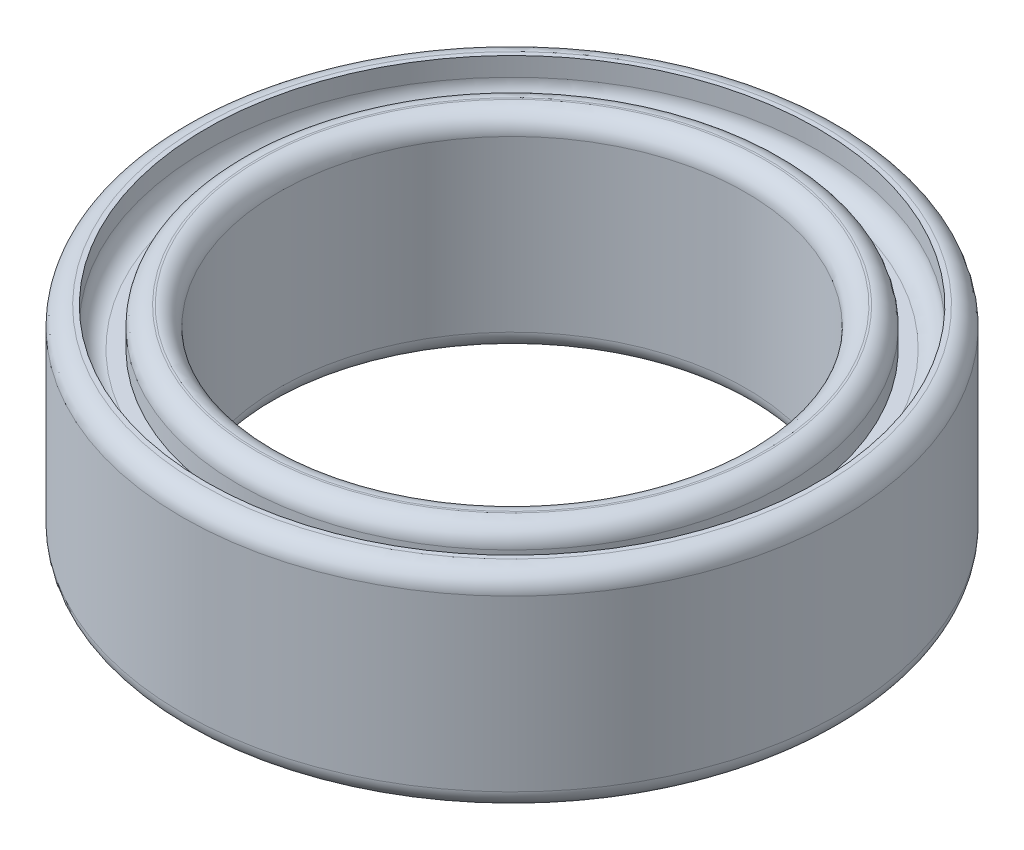
ISO-10303-21;
HEADER;
FILE_DESCRIPTION(('STEP AP214'),'2;1');
FILE_NAME('part.step','',(''),(''),'','','');
FILE_SCHEMA(('AUTOMOTIVE_DESIGN { 1 0 10303 214 1 1 1 1 }'));
ENDSEC;
DATA;
#1=APPLICATION_CONTEXT('core data for automotive mechanical design processes');
#2=APPLICATION_PROTOCOL_DEFINITION('international standard','automotive_design',2000,#1);
#3=PRODUCT_CONTEXT('',#1,'mechanical');
#4=PRODUCT('Part','Part','',(#3));
#5=PRODUCT_RELATED_PRODUCT_CATEGORY('part','',(#4));
#6=PRODUCT_DEFINITION_FORMATION('','',#4);
#7=PRODUCT_DEFINITION_CONTEXT('part definition',#1,'design');
#8=PRODUCT_DEFINITION('design','',#6,#7);
#9=PRODUCT_DEFINITION_SHAPE('','',#8);
#10=(LENGTH_UNIT() NAMED_UNIT(*) SI_UNIT(.MILLI.,.METRE.));
#11=(NAMED_UNIT(*) PLANE_ANGLE_UNIT() SI_UNIT($,.RADIAN.));
#12=(NAMED_UNIT(*) SI_UNIT($,.STERADIAN.) SOLID_ANGLE_UNIT());
#13=UNCERTAINTY_MEASURE_WITH_UNIT(LENGTH_MEASURE(1.E-05),#10,'distance_accuracy_value','');
#14=(GEOMETRIC_REPRESENTATION_CONTEXT(3) GLOBAL_UNCERTAINTY_ASSIGNED_CONTEXT((#13)) GLOBAL_UNIT_ASSIGNED_CONTEXT((#10,
#11,#12)) REPRESENTATION_CONTEXT('',''));
#15=CARTESIAN_POINT('',(0.,0.,0.));
#16=DIRECTION('',(0.,0.,1.));
#17=DIRECTION('',(1.,0.,0.));
#18=AXIS2_PLACEMENT_3D('',#15,#16,#17);
#19=CARTESIAN_POINT('',(0.,0.,0.));
#20=DIRECTION('',(0.,1.,0.));
#21=DIRECTION('',(0.,0.,1.));
#22=AXIS2_PLACEMENT_3D('',#19,#20,#21);
#23=PLANE('',#22);
#24=CARTESIAN_POINT('',(0.,0.,0.));
#25=DIRECTION('',(0.,1.,0.));
#26=DIRECTION('',(0.,0.,1.));
#27=AXIS2_PLACEMENT_3D('',#24,#25,#26);
#28=CIRCLE('',#27,13.5);
#29=CARTESIAN_POINT('',(0.,0.,13.5));
#30=VERTEX_POINT('',#29);
#31=EDGE_CURVE('E77',#30,#30,#28,.F.);
#32=ORIENTED_EDGE('',*,*,#31,.T.);
#33=EDGE_LOOP('',(#32));
#34=FACE_BOUND('',#33,.T.);
#35=CARTESIAN_POINT('',(0.,0.,0.));
#36=DIRECTION('',(0.,1.,0.));
#37=DIRECTION('',(0.,0.,1.));
#38=AXIS2_PLACEMENT_3D('',#35,#36,#37);
#39=CIRCLE('',#38,13.4);
#40=CARTESIAN_POINT('',(0.,0.,13.4));
#41=VERTEX_POINT('',#40);
#42=EDGE_CURVE('E80',#41,#41,#39,.T.);
#43=ORIENTED_EDGE('',*,*,#42,.T.);
#44=EDGE_LOOP('',(#43));
#45=FACE_BOUND('',#44,.T.);
#46=ADVANCED_FACE('F36',(#34,#45),#23,.F.);
#47=CARTESIAN_POINT('',(0.,11.,0.));
#48=DIRECTION('',(0.,1.,0.));
#49=DIRECTION('',(0.,0.,1.));
#50=AXIS2_PLACEMENT_3D('',#47,#48,#49);
#51=PLANE('',#50);
#52=CARTESIAN_POINT('',(0.,11.,0.));
#53=DIRECTION('',(0.,1.,0.));
#54=DIRECTION('',(0.,0.,1.));
#55=AXIS2_PLACEMENT_3D('',#52,#53,#54);
#56=CIRCLE('',#55,13.5);
#57=CARTESIAN_POINT('',(0.,11.,13.5));
#58=VERTEX_POINT('',#57);
#59=EDGE_CURVE('E71',#58,#58,#56,.T.);
#60=ORIENTED_EDGE('',*,*,#59,.T.);
#61=EDGE_LOOP('',(#60));
#62=FACE_BOUND('',#61,.T.);
#63=CARTESIAN_POINT('',(0.,11.,0.));
#64=DIRECTION('',(0.,1.,0.));
#65=DIRECTION('',(0.,0.,1.));
#66=AXIS2_PLACEMENT_3D('',#63,#64,#65);
#67=CIRCLE('',#66,13.4);
#68=CARTESIAN_POINT('',(0.,11.,13.4));
#69=VERTEX_POINT('',#68);
#70=EDGE_CURVE('E83',#69,#69,#67,.F.);
#71=ORIENTED_EDGE('',*,*,#70,.T.);
#72=EDGE_LOOP('',(#71));
#73=FACE_BOUND('',#72,.T.);
#74=ADVANCED_FACE('F121',(#62,#73),#51,.T.);
#75=CARTESIAN_POINT('',(0.,11.,0.));
#76=DIRECTION('',(0.,1.,0.));
#77=DIRECTION('',(0.,0.,1.));
#78=AXIS2_PLACEMENT_3D('',#75,#76,#77);
#79=CIRCLE('',#78,16.5);
#80=CARTESIAN_POINT('',(0.,11.,16.5));
#81=VERTEX_POINT('',#80);
#82=EDGE_CURVE('E65',#81,#81,#79,.T.);
#83=ORIENTED_EDGE('',*,*,#82,.T.);
#84=EDGE_LOOP('',(#83));
#85=FACE_BOUND('',#84,.T.);
#86=CARTESIAN_POINT('',(0.,11.,0.));
#87=DIRECTION('',(0.,1.,0.));
#88=DIRECTION('',(0.,0.,1.));
#89=AXIS2_PLACEMENT_3D('',#86,#87,#88);
#90=CIRCLE('',#89,16.25);
#91=CARTESIAN_POINT('',(0.,11.,16.25));
#92=VERTEX_POINT('',#91);
#93=EDGE_CURVE('E92',#92,#92,#90,.T.);
#94=ORIENTED_EDGE('',*,*,#93,.F.);
#95=EDGE_LOOP('',(#94));
#96=FACE_BOUND('',#95,.T.);
#97=ADVANCED_FACE('F128',(#85,#96),#51,.T.);
#98=CARTESIAN_POINT('',(0.,0.,0.));
#99=DIRECTION('',(0.,1.,0.));
#100=DIRECTION('',(0.,0.,1.));
#101=AXIS2_PLACEMENT_3D('',#98,#99,#100);
#102=CIRCLE('',#101,16.5);
#103=CARTESIAN_POINT('',(0.,0.,16.5));
#104=VERTEX_POINT('',#103);
#105=EDGE_CURVE('E56',#104,#104,#102,.F.);
#106=ORIENTED_EDGE('',*,*,#105,.T.);
#107=EDGE_LOOP('',(#106));
#108=FACE_BOUND('',#107,.T.);
#109=CARTESIAN_POINT('',(0.,0.,0.));
#110=DIRECTION('',(0.,-1.,0.));
#111=DIRECTION('',(0.,0.,-1.));
#112=AXIS2_PLACEMENT_3D('',#109,#110,#111);
#113=CIRCLE('',#112,16.25);
#114=CARTESIAN_POINT('',(0.,0.,-16.25));
#115=VERTEX_POINT('',#114);
#116=EDGE_CURVE('E98',#115,#115,#113,.T.);
#117=ORIENTED_EDGE('',*,*,#116,.F.);
#118=EDGE_LOOP('',(#117));
#119=FACE_BOUND('',#118,.T.);
#120=ADVANCED_FACE('F124',(#108,#119),#23,.F.);
#121=CARTESIAN_POINT('',(0.,11.,0.));
#122=DIRECTION('',(0.,-1.,0.));
#123=DIRECTION('',(0.,0.,-1.));
#124=AXIS2_PLACEMENT_3D('',#121,#122,#123);
#125=CYLINDRICAL_SURFACE('',#124,17.5);
#126=CARTESIAN_POINT('',(0.,10.,0.));
#127=DIRECTION('',(0.,1.,0.));
#128=DIRECTION('',(0.,0.,1.));
#129=AXIS2_PLACEMENT_3D('',#126,#127,#128);
#130=CIRCLE('',#129,17.5);
#131=CARTESIAN_POINT('',(0.,10.,17.5));
#132=VERTEX_POINT('',#131);
#133=EDGE_CURVE('E59',#132,#132,#130,.F.);
#134=ORIENTED_EDGE('',*,*,#133,.T.);
#135=EDGE_LOOP('',(#134));
#136=FACE_BOUND('',#135,.T.);
#137=CARTESIAN_POINT('',(0.,1.,0.));
#138=DIRECTION('',(0.,1.,0.));
#139=DIRECTION('',(0.,0.,1.));
#140=AXIS2_PLACEMENT_3D('',#137,#138,#139);
#141=CIRCLE('',#140,17.5);
#142=CARTESIAN_POINT('',(0.,1.,17.5));
#143=VERTEX_POINT('',#142);
#144=EDGE_CURVE('E62',#143,#143,#141,.T.);
#145=ORIENTED_EDGE('',*,*,#144,.T.);
#146=EDGE_LOOP('',(#145));
#147=FACE_BOUND('',#146,.T.);
#148=ADVANCED_FACE('F134',(#136,#147),#125,.T.);
#149=CARTESIAN_POINT('',(0.,11.,0.));
#150=DIRECTION('',(0.,-1.,0.));
#151=DIRECTION('',(0.,0.,-1.));
#152=AXIS2_PLACEMENT_3D('',#149,#150,#151);
#153=CYLINDRICAL_SURFACE('',#152,12.4);
#154=CARTESIAN_POINT('',(0.,10.,0.));
#155=DIRECTION('',(0.,1.,0.));
#156=DIRECTION('',(0.,0.,1.));
#157=AXIS2_PLACEMENT_3D('',#154,#155,#156);
#158=CIRCLE('',#157,12.4);
#159=CARTESIAN_POINT('',(0.,10.,12.4));
#160=VERTEX_POINT('',#159);
#161=EDGE_CURVE('E86',#160,#160,#158,.T.);
#162=ORIENTED_EDGE('',*,*,#161,.T.);
#163=EDGE_LOOP('',(#162));
#164=FACE_BOUND('',#163,.T.);
#165=CARTESIAN_POINT('',(0.,1.,0.));
#166=DIRECTION('',(0.,1.,0.));
#167=DIRECTION('',(0.,0.,1.));
#168=AXIS2_PLACEMENT_3D('',#165,#166,#167);
#169=CIRCLE('',#168,12.4);
#170=CARTESIAN_POINT('',(0.,1.,12.4));
#171=VERTEX_POINT('',#170);
#172=EDGE_CURVE('E89',#171,#171,#169,.F.);
#173=ORIENTED_EDGE('',*,*,#172,.T.);
#174=EDGE_LOOP('',(#173));
#175=FACE_BOUND('',#174,.T.);
#176=ADVANCED_FACE('F140',(#164,#175),#153,.F.);
#177=CARTESIAN_POINT('',(0.,10.,0.));
#178=DIRECTION('',(0.,1.,0.));
#179=DIRECTION('',(0.,0.,1.));
#180=AXIS2_PLACEMENT_3D('',#177,#178,#179);
#181=TOROIDAL_SURFACE('',#180,13.4,1.);
#182=ORIENTED_EDGE('',*,*,#70,.F.);
#183=EDGE_LOOP('',(#182));
#184=FACE_BOUND('',#183,.T.);
#185=ORIENTED_EDGE('',*,*,#161,.F.);
#186=EDGE_LOOP('',(#185));
#187=FACE_BOUND('',#186,.T.);
#188=ADVANCED_FACE('F175',(#184,#187),#181,.T.);
#189=CARTESIAN_POINT('',(0.,1.,0.));
#190=DIRECTION('',(0.,1.,0.));
#191=DIRECTION('',(0.,0.,1.));
#192=AXIS2_PLACEMENT_3D('',#189,#190,#191);
#193=TOROIDAL_SURFACE('',#192,13.4,1.);
#194=ORIENTED_EDGE('',*,*,#172,.F.);
#195=EDGE_LOOP('',(#194));
#196=FACE_BOUND('',#195,.T.);
#197=ORIENTED_EDGE('',*,*,#42,.F.);
#198=EDGE_LOOP('',(#197));
#199=FACE_BOUND('',#198,.T.);
#200=ADVANCED_FACE('F171',(#196,#199),#193,.T.);
#201=CARTESIAN_POINT('',(0.,9.,0.));
#202=DIRECTION('',(0.,1.,0.));
#203=DIRECTION('',(0.,0.,1.));
#204=AXIS2_PLACEMENT_3D('',#201,#202,#203);
#205=CYLINDRICAL_SURFACE('',#204,16.25);
#206=CARTESIAN_POINT('',(0.,10.,0.));
#207=DIRECTION('',(0.,1.,0.));
#208=DIRECTION('',(0.,0.,1.));
#209=AXIS2_PLACEMENT_3D('',#206,#207,#208);
#210=CIRCLE('',#209,16.25);
#211=CARTESIAN_POINT('',(0.,10.,16.25));
#212=VERTEX_POINT('',#211);
#213=EDGE_CURVE('E47',#212,#212,#210,.F.);
#214=ORIENTED_EDGE('',*,*,#213,.T.);
#215=EDGE_LOOP('',(#214));
#216=FACE_BOUND('',#215,.T.);
#217=ORIENTED_EDGE('',*,*,#93,.T.);
#218=EDGE_LOOP('',(#217));
#219=FACE_BOUND('',#218,.T.);
#220=ADVANCED_FACE('F174',(#216,#219),#205,.F.);
#221=CARTESIAN_POINT('',(0.,9.,0.));
#222=DIRECTION('',(0.,1.,0.));
#223=DIRECTION('',(0.,0.,1.));
#224=AXIS2_PLACEMENT_3D('',#221,#222,#223);
#225=PLANE('',#224);
#226=CARTESIAN_POINT('',(0.,9.,0.));
#227=DIRECTION('',(0.,1.,0.));
#228=DIRECTION('',(0.,0.,1.));
#229=AXIS2_PLACEMENT_3D('',#226,#227,#228);
#230=CIRCLE('',#229,15.25);
#231=CARTESIAN_POINT('',(0.,9.,15.25));
#232=VERTEX_POINT('',#231);
#233=EDGE_CURVE('E51',#232,#232,#230,.T.);
#234=ORIENTED_EDGE('',*,*,#233,.T.);
#235=EDGE_LOOP('',(#234));
#236=FACE_BOUND('',#235,.T.);
#237=CARTESIAN_POINT('',(0.,9.,0.));
#238=DIRECTION('',(0.,1.,0.));
#239=DIRECTION('',(0.,0.,1.));
#240=AXIS2_PLACEMENT_3D('',#237,#238,#239);
#241=CIRCLE('',#240,14.5);
#242=CARTESIAN_POINT('',(0.,9.,14.5));
#243=VERTEX_POINT('',#242);
#244=EDGE_CURVE('E95',#243,#243,#241,.T.);
#245=ORIENTED_EDGE('',*,*,#244,.F.);
#246=EDGE_LOOP('',(#245));
#247=FACE_BOUND('',#246,.T.);
#248=ADVANCED_FACE('F197',(#236,#247),#225,.T.);
#249=CARTESIAN_POINT('',(0.,9.,0.));
#250=DIRECTION('',(0.,1.,0.));
#251=DIRECTION('',(0.,0.,1.));
#252=AXIS2_PLACEMENT_3D('',#249,#250,#251);
#253=CYLINDRICAL_SURFACE('',#252,14.5);
#254=CARTESIAN_POINT('',(0.,10.,0.));
#255=DIRECTION('',(0.,1.,0.));
#256=DIRECTION('',(0.,0.,1.));
#257=AXIS2_PLACEMENT_3D('',#254,#255,#256);
#258=CIRCLE('',#257,14.5);
#259=CARTESIAN_POINT('',(0.,10.,14.5));
#260=VERTEX_POINT('',#259);
#261=EDGE_CURVE('E68',#260,#260,#258,.F.);
#262=ORIENTED_EDGE('',*,*,#261,.T.);
#263=EDGE_LOOP('',(#262));
#264=FACE_BOUND('',#263,.T.);
#265=ORIENTED_EDGE('',*,*,#244,.T.);
#266=EDGE_LOOP('',(#265));
#267=FACE_BOUND('',#266,.T.);
#268=ADVANCED_FACE('F118',(#264,#267),#253,.T.);
#269=CARTESIAN_POINT('',(0.,2.,0.));
#270=DIRECTION('',(0.,-1.,0.));
#271=DIRECTION('',(0.,0.,-1.));
#272=AXIS2_PLACEMENT_3D('',#269,#270,#271);
#273=CYLINDRICAL_SURFACE('',#272,16.25);
#274=CARTESIAN_POINT('',(0.,1.,0.));
#275=DIRECTION('',(0.,-1.,0.));
#276=DIRECTION('',(0.,0.,-1.));
#277=AXIS2_PLACEMENT_3D('',#274,#275,#276);
#278=CIRCLE('',#277,16.25);
#279=CARTESIAN_POINT('',(0.,1.,-16.25));
#280=VERTEX_POINT('',#279);
#281=EDGE_CURVE('E10',#280,#280,#278,.F.);
#282=ORIENTED_EDGE('',*,*,#281,.T.);
#283=EDGE_LOOP('',(#282));
#284=FACE_BOUND('',#283,.T.);
#285=ORIENTED_EDGE('',*,*,#116,.T.);
#286=EDGE_LOOP('',(#285));
#287=FACE_BOUND('',#286,.T.);
#288=ADVANCED_FACE('F109',(#284,#287),#273,.F.);
#289=CARTESIAN_POINT('',(0.,2.,0.));
#290=DIRECTION('',(0.,-1.,0.));
#291=DIRECTION('',(0.,0.,-1.));
#292=AXIS2_PLACEMENT_3D('',#289,#290,#291);
#293=PLANE('',#292);
#294=CARTESIAN_POINT('',(0.,2.,0.));
#295=DIRECTION('',(0.,-1.,0.));
#296=DIRECTION('',(0.,0.,-1.));
#297=AXIS2_PLACEMENT_3D('',#294,#295,#296);
#298=CIRCLE('',#297,15.25);
#299=CARTESIAN_POINT('',(0.,2.,-15.25));
#300=VERTEX_POINT('',#299);
#301=EDGE_CURVE('E43',#300,#300,#298,.T.);
#302=ORIENTED_EDGE('',*,*,#301,.T.);
#303=EDGE_LOOP('',(#302));
#304=FACE_BOUND('',#303,.T.);
#305=CARTESIAN_POINT('',(0.,2.,0.));
#306=DIRECTION('',(0.,-1.,0.));
#307=DIRECTION('',(0.,0.,-1.));
#308=AXIS2_PLACEMENT_3D('',#305,#306,#307);
#309=CIRCLE('',#308,14.5);
#310=CARTESIAN_POINT('',(0.,2.,-14.5));
#311=VERTEX_POINT('',#310);
#312=EDGE_CURVE('E101',#311,#311,#309,.T.);
#313=ORIENTED_EDGE('',*,*,#312,.F.);
#314=EDGE_LOOP('',(#313));
#315=FACE_BOUND('',#314,.T.);
#316=ADVANCED_FACE('F107',(#304,#315),#293,.T.);
#317=CARTESIAN_POINT('',(0.,2.,0.));
#318=DIRECTION('',(0.,-1.,0.));
#319=DIRECTION('',(0.,0.,-1.));
#320=AXIS2_PLACEMENT_3D('',#317,#318,#319);
#321=CYLINDRICAL_SURFACE('',#320,14.5);
#322=CARTESIAN_POINT('',(0.,1.,0.));
#323=DIRECTION('',(0.,1.,0.));
#324=DIRECTION('',(0.,0.,1.));
#325=AXIS2_PLACEMENT_3D('',#322,#323,#324);
#326=CIRCLE('',#325,14.5);
#327=CARTESIAN_POINT('',(0.,1.,14.5));
#328=VERTEX_POINT('',#327);
#329=EDGE_CURVE('E74',#328,#328,#326,.T.);
#330=ORIENTED_EDGE('',*,*,#329,.T.);
#331=EDGE_LOOP('',(#330));
#332=FACE_BOUND('',#331,.T.);
#333=ORIENTED_EDGE('',*,*,#312,.T.);
#334=EDGE_LOOP('',(#333));
#335=FACE_BOUND('',#334,.T.);
#336=ADVANCED_FACE('F105',(#332,#335),#321,.T.);
#337=CARTESIAN_POINT('',(0.,1.,0.));
#338=DIRECTION('',(0.,1.,0.));
#339=DIRECTION('',(0.,0.,1.));
#340=AXIS2_PLACEMENT_3D('',#337,#338,#339);
#341=TOROIDAL_SURFACE('',#340,13.5,1.);
#342=ORIENTED_EDGE('',*,*,#329,.F.);
#343=EDGE_LOOP('',(#342));
#344=FACE_BOUND('',#343,.T.);
#345=ORIENTED_EDGE('',*,*,#31,.F.);
#346=EDGE_LOOP('',(#345));
#347=FACE_BOUND('',#346,.T.);
#348=ADVANCED_FACE('F115',(#344,#347),#341,.T.);
#349=CARTESIAN_POINT('',(0.,10.,0.));
#350=DIRECTION('',(0.,1.,0.));
#351=DIRECTION('',(0.,0.,1.));
#352=AXIS2_PLACEMENT_3D('',#349,#350,#351);
#353=TOROIDAL_SURFACE('',#352,13.5,1.);
#354=ORIENTED_EDGE('',*,*,#261,.F.);
#355=EDGE_LOOP('',(#354));
#356=FACE_BOUND('',#355,.T.);
#357=ORIENTED_EDGE('',*,*,#59,.F.);
#358=EDGE_LOOP('',(#357));
#359=FACE_BOUND('',#358,.T.);
#360=ADVANCED_FACE('F161',(#356,#359),#353,.T.);
#361=CARTESIAN_POINT('',(0.,10.,0.));
#362=DIRECTION('',(0.,1.,0.));
#363=DIRECTION('',(0.,0.,1.));
#364=AXIS2_PLACEMENT_3D('',#361,#362,#363);
#365=TOROIDAL_SURFACE('',#364,16.5,1.);
#366=ORIENTED_EDGE('',*,*,#133,.F.);
#367=EDGE_LOOP('',(#366));
#368=FACE_BOUND('',#367,.T.);
#369=ORIENTED_EDGE('',*,*,#82,.F.);
#370=EDGE_LOOP('',(#369));
#371=FACE_BOUND('',#370,.T.);
#372=ADVANCED_FACE('F152',(#368,#371),#365,.T.);
#373=CARTESIAN_POINT('',(0.,1.,0.));
#374=DIRECTION('',(0.,1.,0.));
#375=DIRECTION('',(0.,0.,1.));
#376=AXIS2_PLACEMENT_3D('',#373,#374,#375);
#377=TOROIDAL_SURFACE('',#376,16.5,1.);
#378=ORIENTED_EDGE('',*,*,#105,.F.);
#379=EDGE_LOOP('',(#378));
#380=FACE_BOUND('',#379,.T.);
#381=ORIENTED_EDGE('',*,*,#144,.F.);
#382=EDGE_LOOP('',(#381));
#383=FACE_BOUND('',#382,.T.);
#384=ADVANCED_FACE('F148',(#380,#383),#377,.T.);
#385=CARTESIAN_POINT('',(0.,10.,0.));
#386=DIRECTION('',(0.,1.,0.));
#387=DIRECTION('',(0.,0.,1.));
#388=AXIS2_PLACEMENT_3D('',#385,#386,#387);
#389=TOROIDAL_SURFACE('',#388,15.25,1.);
#390=ORIENTED_EDGE('',*,*,#213,.F.);
#391=EDGE_LOOP('',(#390));
#392=FACE_BOUND('',#391,.T.);
#393=ORIENTED_EDGE('',*,*,#233,.F.);
#394=EDGE_LOOP('',(#393));
#395=FACE_BOUND('',#394,.T.);
#396=ADVANCED_FACE('F151',(#392,#395),#389,.F.);
#397=CARTESIAN_POINT('',(0.,1.,0.));
#398=DIRECTION('',(0.,-1.,0.));
#399=DIRECTION('',(0.,0.,-1.));
#400=AXIS2_PLACEMENT_3D('',#397,#398,#399);
#401=TOROIDAL_SURFACE('',#400,15.25,1.);
#402=ORIENTED_EDGE('',*,*,#281,.F.);
#403=EDGE_LOOP('',(#402));
#404=FACE_BOUND('',#403,.T.);
#405=ORIENTED_EDGE('',*,*,#301,.F.);
#406=EDGE_LOOP('',(#405));
#407=FACE_BOUND('',#406,.T.);
#408=ADVANCED_FACE('F38',(#404,#407),#401,.F.);
#409=CLOSED_SHELL('',(#46,#74,#97,#120,#148,#176,#188,#200,#220,#248,#268,#288,#316,#336,#348,
#360,#372,#384,#396,#408));
#410=MANIFOLD_SOLID_BREP('B2',#409);
#411=ADVANCED_BREP_SHAPE_REPRESENTATION('',(#18,#410),#14);
#412=SHAPE_DEFINITION_REPRESENTATION(#9,#411);
ENDSEC;
END-ISO-10303-21;
